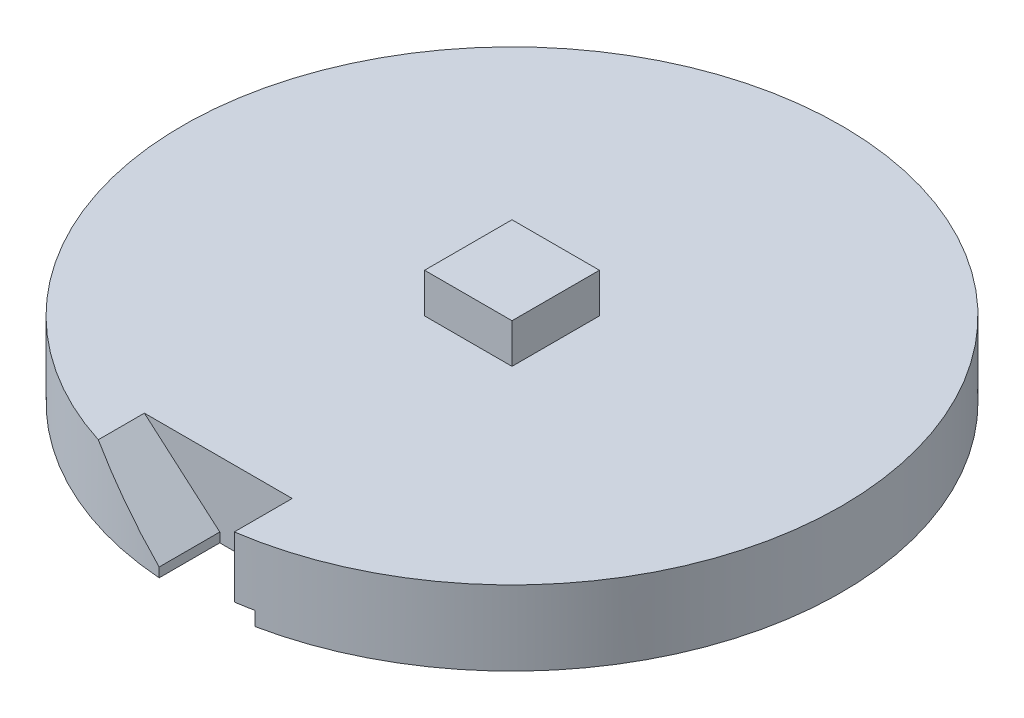
ISO-10303-21;
HEADER;
FILE_DESCRIPTION(('STEP AP214'),'2;1');
FILE_NAME('part.step','',(''),(''),'','','');
FILE_SCHEMA(('AUTOMOTIVE_DESIGN { 1 0 10303 214 1 1 1 1 }'));
ENDSEC;
DATA;
#1=APPLICATION_CONTEXT('core data for automotive mechanical design processes');
#2=APPLICATION_PROTOCOL_DEFINITION('international standard','automotive_design',2000,#1);
#3=PRODUCT_CONTEXT('',#1,'mechanical');
#4=PRODUCT('Part','Part','',(#3));
#5=PRODUCT_RELATED_PRODUCT_CATEGORY('part','',(#4));
#6=PRODUCT_DEFINITION_FORMATION('','',#4);
#7=PRODUCT_DEFINITION_CONTEXT('part definition',#1,'design');
#8=PRODUCT_DEFINITION('design','',#6,#7);
#9=PRODUCT_DEFINITION_SHAPE('','',#8);
#10=(LENGTH_UNIT() NAMED_UNIT(*) SI_UNIT(.MILLI.,.METRE.));
#11=(NAMED_UNIT(*) PLANE_ANGLE_UNIT() SI_UNIT($,.RADIAN.));
#12=(NAMED_UNIT(*) SI_UNIT($,.STERADIAN.) SOLID_ANGLE_UNIT());
#13=UNCERTAINTY_MEASURE_WITH_UNIT(LENGTH_MEASURE(1.E-05),#10,'distance_accuracy_value','');
#14=(GEOMETRIC_REPRESENTATION_CONTEXT(3) GLOBAL_UNCERTAINTY_ASSIGNED_CONTEXT((#13)) GLOBAL_UNIT_ASSIGNED_CONTEXT((#10,
#11,#12)) REPRESENTATION_CONTEXT('',''));
#15=CARTESIAN_POINT('',(0.,0.,0.));
#16=DIRECTION('',(0.,0.,1.));
#17=DIRECTION('',(1.,0.,0.));
#18=AXIS2_PLACEMENT_3D('',#15,#16,#17);
#19=CARTESIAN_POINT('',(0.,8.5,0.));
#20=DIRECTION('',(0.,1.,0.));
#21=DIRECTION('',(0.,0.,1.));
#22=AXIS2_PLACEMENT_3D('',#19,#20,#21);
#23=PLANE('',#22);
#24=DIRECTION('',(0.,0.,1.));
#25=VECTOR('',#24,1.);
#26=CARTESIAN_POINT('',(-11.3352998065365,8.5,30.5));
#27=LINE('',#26,#25);
#28=CARTESIAN_POINT('',(-11.3352998065365,8.5,30.5));
#29=VERTEX_POINT('',#28);
#30=CARTESIAN_POINT('',(-11.3352998065365,8.5,35.7457826644757));
#31=VERTEX_POINT('',#30);
#32=EDGE_CURVE('E315',#29,#31,#27,.T.);
#33=ORIENTED_EDGE('',*,*,#32,.F.);
#34=DIRECTION('',(-1.,0.,0.));
#35=VECTOR('',#34,1.);
#36=CARTESIAN_POINT('',(5.48783229101683,8.5,30.5));
#37=LINE('',#36,#35);
#38=CARTESIAN_POINT('',(5.48783229101683,8.5,30.5));
#39=VERTEX_POINT('',#38);
#40=EDGE_CURVE('E313',#39,#29,#37,.T.);
#41=ORIENTED_EDGE('',*,*,#40,.F.);
#42=DIRECTION('',(0.,0.,1.));
#43=VECTOR('',#42,1.);
#44=CARTESIAN_POINT('',(5.48783229101683,8.5,30.5));
#45=LINE('',#44,#43);
#46=CARTESIAN_POINT('',(5.48783229101683,8.5,37.0962760495669));
#47=VERTEX_POINT('',#46);
#48=EDGE_CURVE('E307',#39,#47,#45,.T.);
#49=ORIENTED_EDGE('',*,*,#48,.T.);
#50=CARTESIAN_POINT('',(0.,8.5,0.));
#51=DIRECTION('',(0.,1.,0.));
#52=DIRECTION('',(0.,0.,1.));
#53=AXIS2_PLACEMENT_3D('',#50,#51,#52);
#54=CIRCLE('',#53,37.5);
#55=EDGE_CURVE('E286',#47,#31,#54,.T.);
#56=ORIENTED_EDGE('',*,*,#55,.T.);
#57=EDGE_LOOP('',(#33,#41,#49,#56));
#58=FACE_BOUND('',#57,.T.);
#59=DIRECTION('',(1.,0.,0.));
#60=VECTOR('',#59,1.);
#61=CARTESIAN_POINT('',(0.,8.5,-4.975));
#62=LINE('',#61,#60);
#63=CARTESIAN_POINT('',(-4.975,8.5,-4.975));
#64=VERTEX_POINT('',#63);
#65=CARTESIAN_POINT('',(4.975,8.5,-4.975));
#66=VERTEX_POINT('',#65);
#67=EDGE_CURVE('E278',#64,#66,#62,.T.);
#68=ORIENTED_EDGE('',*,*,#67,.T.);
#69=DIRECTION('',(0.,0.,1.));
#70=VECTOR('',#69,1.);
#71=CARTESIAN_POINT('',(4.975,8.5,0.));
#72=LINE('',#71,#70);
#73=CARTESIAN_POINT('',(4.975,8.5,4.975));
#74=VERTEX_POINT('',#73);
#75=EDGE_CURVE('E282',#66,#74,#72,.T.);
#76=ORIENTED_EDGE('',*,*,#75,.T.);
#77=DIRECTION('',(-1.,0.,0.));
#78=VECTOR('',#77,1.);
#79=CARTESIAN_POINT('',(0.,8.5,4.975));
#80=LINE('',#79,#78);
#81=CARTESIAN_POINT('',(-4.975,8.5,4.975));
#82=VERTEX_POINT('',#81);
#83=EDGE_CURVE('E270',#74,#82,#80,.T.);
#84=ORIENTED_EDGE('',*,*,#83,.T.);
#85=DIRECTION('',(0.,0.,-1.));
#86=VECTOR('',#85,1.);
#87=CARTESIAN_POINT('',(-4.975,8.5,0.));
#88=LINE('',#87,#86);
#89=EDGE_CURVE('E274',#82,#64,#88,.T.);
#90=ORIENTED_EDGE('',*,*,#89,.T.);
#91=EDGE_LOOP('',(#68,#76,#84,#90));
#92=FACE_BOUND('',#91,.T.);
#93=ADVANCED_FACE('F45',(#58,#92),#23,.T.);
#94=CARTESIAN_POINT('',(0.,8.5,0.));
#95=DIRECTION('',(0.,-1.,0.));
#96=DIRECTION('',(0.,0.,-1.));
#97=AXIS2_PLACEMENT_3D('',#94,#95,#96);
#98=CYLINDRICAL_SURFACE('',#97,37.5);
#99=CARTESIAN_POINT('',(0.,0.,0.));
#100=DIRECTION('',(0.,1.,0.));
#101=DIRECTION('',(0.,0.,1.));
#102=AXIS2_PLACEMENT_3D('',#99,#100,#101);
#103=CIRCLE('',#102,37.5);
#104=CARTESIAN_POINT('',(7.49309439374879,0.,36.7437550667643));
#105=VERTEX_POINT('',#104);
#106=CARTESIAN_POINT('',(-2.75755208033518,0.,37.3984746550476));
#107=VERTEX_POINT('',#106);
#108=EDGE_CURVE('E179',#105,#107,#103,.T.);
#109=ORIENTED_EDGE('',*,*,#108,.T.);
#110=DIRECTION('',(0.,-1.,0.));
#111=VECTOR('',#110,1.);
#112=CARTESIAN_POINT('',(-2.75755208033518,8.5,37.3984746550476));
#113=LINE('',#112,#111);
#114=CARTESIAN_POINT('',(-2.75755208033518,1.07247206861908,37.3984746550476));
#115=VERTEX_POINT('',#114);
#116=EDGE_CURVE('E193',#107,#115,#113,.F.);
#117=ORIENTED_EDGE('',*,*,#116,.T.);
#118=CARTESIAN_POINT('',(0.,-1.315310336821,0.));
#119=DIRECTION('',(-0.654602325716553,-0.755973409033995,0.));
#120=DIRECTION('',(0.755973409033995,-0.654602325716553,0.));
#121=AXIS2_PLACEMENT_3D('',#118,#119,#120);
#122=ELLIPSE('',#121,49.6049193686833,37.5);
#123=EDGE_CURVE('E11',#115,#31,#122,.T.);
#124=ORIENTED_EDGE('',*,*,#123,.T.);
#125=ORIENTED_EDGE('',*,*,#55,.F.);
#126=DIRECTION('',(0.,-1.,0.));
#127=VECTOR('',#126,1.);
#128=CARTESIAN_POINT('',(5.48783229101683,8.5,37.0962760495669));
#129=LINE('',#128,#127);
#130=CARTESIAN_POINT('',(5.48783229101683,1.59559495075865,37.0962760495669));
#131=VERTEX_POINT('',#130);
#132=EDGE_CURVE('E54',#47,#131,#129,.T.);
#133=ORIENTED_EDGE('',*,*,#132,.T.);
#134=CARTESIAN_POINT('',(0.,1.59559495075865,0.));
#135=DIRECTION('',(0.,1.,0.));
#136=DIRECTION('',(0.,0.,1.));
#137=AXIS2_PLACEMENT_3D('',#134,#135,#136);
#138=CIRCLE('',#137,37.5);
#139=CARTESIAN_POINT('',(7.49309439374879,1.59559495075865,36.7437550667644));
#140=VERTEX_POINT('',#139);
#141=EDGE_CURVE('E163',#131,#140,#138,.T.);
#142=ORIENTED_EDGE('',*,*,#141,.T.);
#143=DIRECTION('',(0.,-1.,0.));
#144=VECTOR('',#143,1.);
#145=CARTESIAN_POINT('',(7.49309439374878,8.50000000000001,36.7437550667644));
#146=LINE('',#145,#144);
#147=EDGE_CURVE('E190',#140,#105,#146,.T.);
#148=ORIENTED_EDGE('',*,*,#147,.T.);
#149=EDGE_LOOP('',(#109,#117,#124,#125,#133,#142,#148));
#150=FACE_BOUND('',#149,.T.);
#151=ADVANCED_FACE('F47',(#150),#98,.T.);
#152=CARTESIAN_POINT('',(0.,0.,0.));
#153=DIRECTION('',(0.,1.,0.));
#154=DIRECTION('',(0.,0.,1.));
#155=AXIS2_PLACEMENT_3D('',#152,#153,#154);
#156=PLANE('',#155);
#157=CARTESIAN_POINT('',(0.,0.,0.));
#158=DIRECTION('',(0.,1.,0.));
#159=DIRECTION('',(0.,0.,1.));
#160=AXIS2_PLACEMENT_3D('',#157,#158,#159);
#161=CIRCLE('',#160,5.);
#162=CARTESIAN_POINT('',(0.,0.,5.));
#163=VERTEX_POINT('',#162);
#164=EDGE_CURVE('E164',#163,#163,#161,.F.);
#165=ORIENTED_EDGE('',*,*,#164,.F.);
#166=EDGE_LOOP('',(#165));
#167=FACE_BOUND('',#166,.T.);
#168=DIRECTION('',(-1.,0.,0.));
#169=VECTOR('',#168,1.);
#170=CARTESIAN_POINT('',(0.,0.,30.5));
#171=LINE('',#170,#169);
#172=CARTESIAN_POINT('',(7.49309439374879,0.,30.5));
#173=VERTEX_POINT('',#172);
#174=CARTESIAN_POINT('',(-2.75755208033518,0.,30.5));
#175=VERTEX_POINT('',#174);
#176=EDGE_CURVE('E154',#173,#175,#171,.T.);
#177=ORIENTED_EDGE('',*,*,#176,.T.);
#178=DIRECTION('',(0.,0.,1.));
#179=VECTOR('',#178,1.);
#180=CARTESIAN_POINT('',(-2.75755208033518,0.,30.5));
#181=LINE('',#180,#179);
#182=EDGE_CURVE('E194',#175,#107,#181,.T.);
#183=ORIENTED_EDGE('',*,*,#182,.T.);
#184=ORIENTED_EDGE('',*,*,#108,.F.);
#185=DIRECTION('',(0.,0.,1.));
#186=VECTOR('',#185,1.);
#187=CARTESIAN_POINT('',(7.49309439374879,0.,30.5));
#188=LINE('',#187,#186);
#189=EDGE_CURVE('E168',#173,#105,#188,.T.);
#190=ORIENTED_EDGE('',*,*,#189,.F.);
#191=EDGE_LOOP('',(#177,#183,#184,#190));
#192=FACE_BOUND('',#191,.T.);
#193=ADVANCED_FACE('F177',(#167,#192),#156,.F.);
#194=CARTESIAN_POINT('',(4.975,13.,-4.975));
#195=DIRECTION('',(-1.,0.,0.));
#196=DIRECTION('',(0.,0.,1.));
#197=AXIS2_PLACEMENT_3D('',#194,#195,#196);
#198=PLANE('',#197);
#199=ORIENTED_EDGE('',*,*,#75,.F.);
#200=DIRECTION('',(0.,-1.,0.));
#201=VECTOR('',#200,1.);
#202=CARTESIAN_POINT('',(4.975,13.,-4.975));
#203=LINE('',#202,#201);
#204=CARTESIAN_POINT('',(4.975,13.,-4.975));
#205=VERTEX_POINT('',#204);
#206=EDGE_CURVE('E266',#205,#66,#203,.T.);
#207=ORIENTED_EDGE('',*,*,#206,.F.);
#208=DIRECTION('',(0.,0.,-1.));
#209=VECTOR('',#208,1.);
#210=CARTESIAN_POINT('',(4.975,13.,-4.975));
#211=LINE('',#210,#209);
#212=CARTESIAN_POINT('',(4.975,13.,4.975));
#213=VERTEX_POINT('',#212);
#214=EDGE_CURVE('E242',#213,#205,#211,.T.);
#215=ORIENTED_EDGE('',*,*,#214,.F.);
#216=DIRECTION('',(0.,-1.,0.));
#217=VECTOR('',#216,1.);
#218=CARTESIAN_POINT('',(4.975,13.,4.975));
#219=LINE('',#218,#217);
#220=EDGE_CURVE('E255',#213,#74,#219,.T.);
#221=ORIENTED_EDGE('',*,*,#220,.T.);
#222=EDGE_LOOP('',(#199,#207,#215,#221));
#223=FACE_BOUND('',#222,.T.);
#224=ADVANCED_FACE('F356',(#223),#198,.F.);
#225=CARTESIAN_POINT('',(-4.975,13.,-4.975));
#226=DIRECTION('',(0.,0.,1.));
#227=DIRECTION('',(1.,0.,0.));
#228=AXIS2_PLACEMENT_3D('',#225,#226,#227);
#229=PLANE('',#228);
#230=ORIENTED_EDGE('',*,*,#67,.F.);
#231=DIRECTION('',(0.,-1.,0.));
#232=VECTOR('',#231,1.);
#233=CARTESIAN_POINT('',(-4.975,13.,-4.975));
#234=LINE('',#233,#232);
#235=CARTESIAN_POINT('',(-4.975,13.,-4.975));
#236=VERTEX_POINT('',#235);
#237=EDGE_CURVE('E262',#236,#64,#234,.T.);
#238=ORIENTED_EDGE('',*,*,#237,.F.);
#239=DIRECTION('',(-1.,0.,0.));
#240=VECTOR('',#239,1.);
#241=CARTESIAN_POINT('',(-4.975,13.,-4.975));
#242=LINE('',#241,#240);
#243=EDGE_CURVE('E246',#205,#236,#242,.T.);
#244=ORIENTED_EDGE('',*,*,#243,.F.);
#245=ORIENTED_EDGE('',*,*,#206,.T.);
#246=EDGE_LOOP('',(#230,#238,#244,#245));
#247=FACE_BOUND('',#246,.T.);
#248=ADVANCED_FACE('F364',(#247),#229,.F.);
#249=CARTESIAN_POINT('',(-4.975,13.,-4.975));
#250=DIRECTION('',(1.,0.,0.));
#251=DIRECTION('',(0.,0.,-1.));
#252=AXIS2_PLACEMENT_3D('',#249,#250,#251);
#253=PLANE('',#252);
#254=ORIENTED_EDGE('',*,*,#89,.F.);
#255=DIRECTION('',(0.,-1.,0.));
#256=VECTOR('',#255,1.);
#257=CARTESIAN_POINT('',(-4.975,13.,4.975));
#258=LINE('',#257,#256);
#259=CARTESIAN_POINT('',(-4.975,13.,4.975));
#260=VERTEX_POINT('',#259);
#261=EDGE_CURVE('E259',#260,#82,#258,.T.);
#262=ORIENTED_EDGE('',*,*,#261,.F.);
#263=DIRECTION('',(0.,0.,1.));
#264=VECTOR('',#263,1.);
#265=CARTESIAN_POINT('',(-4.975,13.,-4.975));
#266=LINE('',#265,#264);
#267=EDGE_CURVE('E249',#236,#260,#266,.T.);
#268=ORIENTED_EDGE('',*,*,#267,.F.);
#269=ORIENTED_EDGE('',*,*,#237,.T.);
#270=EDGE_LOOP('',(#254,#262,#268,#269));
#271=FACE_BOUND('',#270,.T.);
#272=ADVANCED_FACE('F389',(#271),#253,.F.);
#273=CARTESIAN_POINT('',(-4.975,13.,4.975));
#274=DIRECTION('',(0.,0.,-1.));
#275=DIRECTION('',(-1.,0.,0.));
#276=AXIS2_PLACEMENT_3D('',#273,#274,#275);
#277=PLANE('',#276);
#278=ORIENTED_EDGE('',*,*,#83,.F.);
#279=ORIENTED_EDGE('',*,*,#220,.F.);
#280=DIRECTION('',(1.,0.,0.));
#281=VECTOR('',#280,1.);
#282=CARTESIAN_POINT('',(-4.975,13.,4.975));
#283=LINE('',#282,#281);
#284=EDGE_CURVE('E252',#260,#213,#283,.T.);
#285=ORIENTED_EDGE('',*,*,#284,.F.);
#286=ORIENTED_EDGE('',*,*,#261,.T.);
#287=EDGE_LOOP('',(#278,#279,#285,#286));
#288=FACE_BOUND('',#287,.T.);
#289=ADVANCED_FACE('F381',(#288),#277,.F.);
#290=CARTESIAN_POINT('',(0.,13.,0.));
#291=DIRECTION('',(0.,1.,0.));
#292=DIRECTION('',(0.,0.,1.));
#293=AXIS2_PLACEMENT_3D('',#290,#291,#292);
#294=PLANE('',#293);
#295=ORIENTED_EDGE('',*,*,#214,.T.);
#296=ORIENTED_EDGE('',*,*,#243,.T.);
#297=ORIENTED_EDGE('',*,*,#267,.T.);
#298=ORIENTED_EDGE('',*,*,#284,.T.);
#299=EDGE_LOOP('',(#295,#296,#297,#298));
#300=FACE_BOUND('',#299,.T.);
#301=ADVANCED_FACE('F371',(#300),#294,.T.);
#302=CARTESIAN_POINT('',(0.,-10.,0.));
#303=DIRECTION('',(0.,1.,0.));
#304=DIRECTION('',(0.,0.,1.));
#305=AXIS2_PLACEMENT_3D('',#302,#303,#304);
#306=CYLINDRICAL_SURFACE('',#305,5.);
#307=CARTESIAN_POINT('',(0.,-10.,0.));
#308=DIRECTION('',(0.,-1.,0.));
#309=DIRECTION('',(0.,0.,-1.));
#310=AXIS2_PLACEMENT_3D('',#307,#308,#309);
#311=CIRCLE('',#310,5.);
#312=CARTESIAN_POINT('',(0.,-10.,-5.));
#313=VERTEX_POINT('',#312);
#314=EDGE_CURVE('E230',#313,#313,#311,.T.);
#315=ORIENTED_EDGE('',*,*,#314,.F.);
#316=EDGE_LOOP('',(#315));
#317=FACE_BOUND('',#316,.T.);
#318=ORIENTED_EDGE('',*,*,#164,.T.);
#319=EDGE_LOOP('',(#318));
#320=FACE_BOUND('',#319,.T.);
#321=ADVANCED_FACE('F368',(#317,#320),#306,.T.);
#322=CARTESIAN_POINT('',(0.,-10.,0.));
#323=DIRECTION('',(0.,-1.,0.));
#324=DIRECTION('',(0.,0.,-1.));
#325=AXIS2_PLACEMENT_3D('',#322,#323,#324);
#326=PLANE('',#325);
#327=DIRECTION('',(0.,0.,1.));
#328=VECTOR('',#327,1.);
#329=CARTESIAN_POINT('',(2.59784134756349,-10.,-1.32823797865468));
#330=LINE('',#329,#328);
#331=CARTESIAN_POINT('',(2.59784134756349,-10.,-1.32823797865468));
#332=VERTEX_POINT('',#331);
#333=CARTESIAN_POINT('',(2.59784134756349,-10.,1.67176202134533));
#334=VERTEX_POINT('',#333);
#335=EDGE_CURVE('E69',#332,#334,#330,.T.);
#336=ORIENTED_EDGE('',*,*,#335,.F.);
#337=DIRECTION('',(-1.,0.,0.));
#338=VECTOR('',#337,1.);
#339=CARTESIAN_POINT('',(2.59784134756349,-10.,-1.32823797865468));
#340=LINE('',#339,#338);
#341=CARTESIAN_POINT('',(-2.40215865243651,-10.,-1.32823797865468));
#342=VERTEX_POINT('',#341);
#343=EDGE_CURVE('E203',#332,#342,#340,.T.);
#344=ORIENTED_EDGE('',*,*,#343,.T.);
#345=DIRECTION('',(0.,0.,-1.));
#346=VECTOR('',#345,1.);
#347=CARTESIAN_POINT('',(-2.40215865243651,-10.,1.67176202134533));
#348=LINE('',#347,#346);
#349=CARTESIAN_POINT('',(-2.40215865243651,-10.,1.67176202134533));
#350=VERTEX_POINT('',#349);
#351=EDGE_CURVE('E220',#350,#342,#348,.T.);
#352=ORIENTED_EDGE('',*,*,#351,.F.);
#353=DIRECTION('',(1.,0.,0.));
#354=VECTOR('',#353,1.);
#355=CARTESIAN_POINT('',(-2.40215865243651,-10.,1.67176202134533));
#356=LINE('',#355,#354);
#357=EDGE_CURVE('E216',#350,#334,#356,.T.);
#358=ORIENTED_EDGE('',*,*,#357,.T.);
#359=EDGE_LOOP('',(#336,#344,#352,#358));
#360=FACE_BOUND('',#359,.T.);
#361=ORIENTED_EDGE('',*,*,#314,.T.);
#362=EDGE_LOOP('',(#361));
#363=FACE_BOUND('',#362,.T.);
#364=ADVANCED_FACE('F370',(#360,#363),#326,.T.);
#365=CARTESIAN_POINT('',(2.59784134756349,0.,-1.32823797865468));
#366=DIRECTION('',(1.,0.,0.));
#367=DIRECTION('',(0.,0.,-1.));
#368=AXIS2_PLACEMENT_3D('',#365,#366,#367);
#369=PLANE('',#368);
#370=ORIENTED_EDGE('',*,*,#335,.T.);
#371=DIRECTION('',(0.,-1.,0.));
#372=VECTOR('',#371,1.);
#373=CARTESIAN_POINT('',(2.59784134756349,0.,1.67176202134533));
#374=LINE('',#373,#372);
#375=CARTESIAN_POINT('',(2.59784134756349,0.,1.67176202134533));
#376=VERTEX_POINT('',#375);
#377=EDGE_CURVE('E213',#376,#334,#374,.T.);
#378=ORIENTED_EDGE('',*,*,#377,.F.);
#379=DIRECTION('',(0.,0.,1.));
#380=VECTOR('',#379,1.);
#381=CARTESIAN_POINT('',(2.59784134756349,0.,-1.32823797865468));
#382=LINE('',#381,#380);
#383=CARTESIAN_POINT('',(2.59784134756349,0.,-1.32823797865468));
#384=VERTEX_POINT('',#383);
#385=EDGE_CURVE('E198',#384,#376,#382,.T.);
#386=ORIENTED_EDGE('',*,*,#385,.F.);
#387=DIRECTION('',(0.,-1.,0.));
#388=VECTOR('',#387,1.);
#389=CARTESIAN_POINT('',(2.59784134756349,0.,-1.32823797865468));
#390=LINE('',#389,#388);
#391=EDGE_CURVE('E227',#384,#332,#390,.T.);
#392=ORIENTED_EDGE('',*,*,#391,.T.);
#393=EDGE_LOOP('',(#370,#378,#386,#392));
#394=FACE_BOUND('',#393,.T.);
#395=ADVANCED_FACE('F378',(#394),#369,.F.);
#396=CARTESIAN_POINT('',(2.59784134756349,0.,-1.32823797865468));
#397=DIRECTION('',(0.,0.,1.));
#398=DIRECTION('',(1.,0.,0.));
#399=AXIS2_PLACEMENT_3D('',#396,#397,#398);
#400=PLANE('',#399);
#401=ORIENTED_EDGE('',*,*,#343,.F.);
#402=ORIENTED_EDGE('',*,*,#391,.F.);
#403=DIRECTION('',(-1.,0.,0.));
#404=VECTOR('',#403,1.);
#405=CARTESIAN_POINT('',(2.59784134756349,0.,-1.32823797865468));
#406=LINE('',#405,#404);
#407=CARTESIAN_POINT('',(-2.40215865243651,0.,-1.32823797865468));
#408=VERTEX_POINT('',#407);
#409=EDGE_CURVE('E210',#384,#408,#406,.T.);
#410=ORIENTED_EDGE('',*,*,#409,.T.);
#411=DIRECTION('',(0.,-1.,0.));
#412=VECTOR('',#411,1.);
#413=CARTESIAN_POINT('',(-2.40215865243651,0.,-1.32823797865468));
#414=LINE('',#413,#412);
#415=EDGE_CURVE('E231',#408,#342,#414,.T.);
#416=ORIENTED_EDGE('',*,*,#415,.T.);
#417=EDGE_LOOP('',(#401,#402,#410,#416));
#418=FACE_BOUND('',#417,.T.);
#419=ADVANCED_FACE('F442',(#418),#400,.T.);
#420=CARTESIAN_POINT('',(-2.40215865243651,0.,1.67176202134533));
#421=DIRECTION('',(-1.,0.,0.));
#422=DIRECTION('',(0.,0.,1.));
#423=AXIS2_PLACEMENT_3D('',#420,#421,#422);
#424=PLANE('',#423);
#425=ORIENTED_EDGE('',*,*,#351,.T.);
#426=ORIENTED_EDGE('',*,*,#415,.F.);
#427=DIRECTION('',(0.,0.,-1.));
#428=VECTOR('',#427,1.);
#429=CARTESIAN_POINT('',(-2.40215865243651,0.,1.67176202134533));
#430=LINE('',#429,#428);
#431=CARTESIAN_POINT('',(-2.40215865243651,0.,1.67176202134533));
#432=VERTEX_POINT('',#431);
#433=EDGE_CURVE('E206',#432,#408,#430,.T.);
#434=ORIENTED_EDGE('',*,*,#433,.F.);
#435=DIRECTION('',(0.,-1.,0.));
#436=VECTOR('',#435,1.);
#437=CARTESIAN_POINT('',(-2.40215865243651,0.,1.67176202134533));
#438=LINE('',#437,#436);
#439=EDGE_CURVE('E234',#432,#350,#438,.T.);
#440=ORIENTED_EDGE('',*,*,#439,.T.);
#441=EDGE_LOOP('',(#425,#426,#434,#440));
#442=FACE_BOUND('',#441,.T.);
#443=ADVANCED_FACE('F450',(#442),#424,.F.);
#444=CARTESIAN_POINT('',(-2.40215865243651,0.,1.67176202134533));
#445=DIRECTION('',(0.,0.,-1.));
#446=DIRECTION('',(-1.,0.,0.));
#447=AXIS2_PLACEMENT_3D('',#444,#445,#446);
#448=PLANE('',#447);
#449=ORIENTED_EDGE('',*,*,#357,.F.);
#450=ORIENTED_EDGE('',*,*,#439,.F.);
#451=DIRECTION('',(1.,0.,0.));
#452=VECTOR('',#451,1.);
#453=CARTESIAN_POINT('',(-2.40215865243651,0.,1.67176202134533));
#454=LINE('',#453,#452);
#455=EDGE_CURVE('E202',#432,#376,#454,.T.);
#456=ORIENTED_EDGE('',*,*,#455,.T.);
#457=ORIENTED_EDGE('',*,*,#377,.T.);
#458=EDGE_LOOP('',(#449,#450,#456,#457));
#459=FACE_BOUND('',#458,.T.);
#460=ADVANCED_FACE('F460',(#459),#448,.T.);
#461=CARTESIAN_POINT('',(0.,0.,0.));
#462=DIRECTION('',(0.,1.,0.));
#463=DIRECTION('',(0.,0.,1.));
#464=AXIS2_PLACEMENT_3D('',#461,#462,#463);
#465=PLANE('',#464);
#466=ORIENTED_EDGE('',*,*,#385,.T.);
#467=ORIENTED_EDGE('',*,*,#455,.F.);
#468=ORIENTED_EDGE('',*,*,#433,.T.);
#469=ORIENTED_EDGE('',*,*,#409,.F.);
#470=EDGE_LOOP('',(#466,#467,#468,#469));
#471=FACE_BOUND('',#470,.T.);
#472=ADVANCED_FACE('F470',(#471),#465,.F.);
#473=CARTESIAN_POINT('',(-11.3352998065365,8.5,30.5));
#474=DIRECTION('',(-0.654602325716553,-0.755973409033995,0.));
#475=DIRECTION('',(0.755973409033995,-0.654602325716553,0.));
#476=AXIS2_PLACEMENT_3D('',#473,#474,#475);
#477=PLANE('',#476);
#478=DIRECTION('',(0.,0.,1.));
#479=VECTOR('',#478,1.);
#480=CARTESIAN_POINT('',(-2.75755208033518,1.07247206861908,30.5));
#481=LINE('',#480,#479);
#482=CARTESIAN_POINT('',(-2.75755208033518,1.07247206861908,30.5));
#483=VERTEX_POINT('',#482);
#484=EDGE_CURVE('E319',#483,#115,#481,.T.);
#485=ORIENTED_EDGE('',*,*,#484,.F.);
#486=DIRECTION('',(0.755973409033995,-0.654602325716553,0.));
#487=VECTOR('',#486,1.);
#488=CARTESIAN_POINT('',(-11.3352998065365,8.5,30.5));
#489=LINE('',#488,#487);
#490=EDGE_CURVE('E186',#29,#483,#489,.T.);
#491=ORIENTED_EDGE('',*,*,#490,.F.);
#492=ORIENTED_EDGE('',*,*,#32,.T.);
#493=ORIENTED_EDGE('',*,*,#123,.F.);
#494=EDGE_LOOP('',(#485,#491,#492,#493));
#495=FACE_BOUND('',#494,.T.);
#496=ADVANCED_FACE('F346',(#495),#477,.F.);
#497=CARTESIAN_POINT('',(5.48783229101683,5.96572027218461,30.5));
#498=DIRECTION('',(1.,0.,0.));
#499=DIRECTION('',(0.,0.,-1.));
#500=AXIS2_PLACEMENT_3D('',#497,#498,#499);
#501=PLANE('',#500);
#502=ORIENTED_EDGE('',*,*,#48,.F.);
#503=DIRECTION('',(0.,1.,0.));
#504=VECTOR('',#503,1.);
#505=CARTESIAN_POINT('',(5.48783229101683,5.96572027218461,30.5));
#506=LINE('',#505,#504);
#507=CARTESIAN_POINT('',(5.48783229101683,1.59559495075865,30.5));
#508=VERTEX_POINT('',#507);
#509=EDGE_CURVE('E331',#508,#39,#506,.T.);
#510=ORIENTED_EDGE('',*,*,#509,.F.);
#511=DIRECTION('',(0.,0.,1.));
#512=VECTOR('',#511,1.);
#513=CARTESIAN_POINT('',(5.48783229101683,1.59559495075865,30.5));
#514=LINE('',#513,#512);
#515=EDGE_CURVE('E184',#508,#131,#514,.T.);
#516=ORIENTED_EDGE('',*,*,#515,.T.);
#517=ORIENTED_EDGE('',*,*,#132,.F.);
#518=EDGE_LOOP('',(#502,#510,#516,#517));
#519=FACE_BOUND('',#518,.T.);
#520=ADVANCED_FACE('F305',(#519),#501,.F.);
#521=CARTESIAN_POINT('',(5.48783229101683,1.59559495075865,30.5));
#522=DIRECTION('',(0.,1.,0.));
#523=DIRECTION('',(0.,0.,1.));
#524=AXIS2_PLACEMENT_3D('',#521,#522,#523);
#525=PLANE('',#524);
#526=ORIENTED_EDGE('',*,*,#515,.F.);
#527=DIRECTION('',(-1.,0.,0.));
#528=VECTOR('',#527,1.);
#529=CARTESIAN_POINT('',(5.48783229101683,1.59559495075865,30.5));
#530=LINE('',#529,#528);
#531=CARTESIAN_POINT('',(7.49309439374879,1.59559495075865,30.5));
#532=VERTEX_POINT('',#531);
#533=EDGE_CURVE('E174',#532,#508,#530,.T.);
#534=ORIENTED_EDGE('',*,*,#533,.F.);
#535=DIRECTION('',(0.,0.,1.));
#536=VECTOR('',#535,1.);
#537=CARTESIAN_POINT('',(7.49309439374879,1.59559495075865,30.5));
#538=LINE('',#537,#536);
#539=EDGE_CURVE('E171',#532,#140,#538,.T.);
#540=ORIENTED_EDGE('',*,*,#539,.T.);
#541=ORIENTED_EDGE('',*,*,#141,.F.);
#542=EDGE_LOOP('',(#526,#534,#540,#541));
#543=FACE_BOUND('',#542,.T.);
#544=ADVANCED_FACE('F336',(#543),#525,.F.);
#545=CARTESIAN_POINT('',(-2.75755208033518,0.,30.5));
#546=DIRECTION('',(-1.,0.,0.));
#547=DIRECTION('',(0.,0.,1.));
#548=AXIS2_PLACEMENT_3D('',#545,#546,#547);
#549=PLANE('',#548);
#550=ORIENTED_EDGE('',*,*,#182,.F.);
#551=DIRECTION('',(0.,-1.,0.));
#552=VECTOR('',#551,1.);
#553=CARTESIAN_POINT('',(-2.75755208033518,0.,30.5));
#554=LINE('',#553,#552);
#555=EDGE_CURVE('E61',#483,#175,#554,.T.);
#556=ORIENTED_EDGE('',*,*,#555,.F.);
#557=ORIENTED_EDGE('',*,*,#484,.T.);
#558=ORIENTED_EDGE('',*,*,#116,.F.);
#559=EDGE_LOOP('',(#550,#556,#557,#558));
#560=FACE_BOUND('',#559,.T.);
#561=ADVANCED_FACE('F338',(#560),#549,.F.);
#562=CARTESIAN_POINT('',(7.49309439374879,1.59559495075865,30.5));
#563=DIRECTION('',(1.,0.,0.));
#564=DIRECTION('',(0.,1.,0.));
#565=AXIS2_PLACEMENT_3D('',#562,#563,#564);
#566=PLANE('',#565);
#567=ORIENTED_EDGE('',*,*,#539,.F.);
#568=DIRECTION('',(0.,1.,0.));
#569=VECTOR('',#568,1.);
#570=CARTESIAN_POINT('',(7.49309439374879,1.59559495075865,30.5));
#571=LINE('',#570,#569);
#572=EDGE_CURVE('E158',#173,#532,#571,.T.);
#573=ORIENTED_EDGE('',*,*,#572,.F.);
#574=ORIENTED_EDGE('',*,*,#189,.T.);
#575=ORIENTED_EDGE('',*,*,#147,.F.);
#576=EDGE_LOOP('',(#567,#573,#574,#575));
#577=FACE_BOUND('',#576,.T.);
#578=ADVANCED_FACE('F167',(#577),#566,.F.);
#579=CARTESIAN_POINT('',(0.,0.,30.5));
#580=DIRECTION('',(0.,0.,-1.));
#581=DIRECTION('',(-1.,0.,0.));
#582=AXIS2_PLACEMENT_3D('',#579,#580,#581);
#583=PLANE('',#582);
#584=ORIENTED_EDGE('',*,*,#572,.T.);
#585=ORIENTED_EDGE('',*,*,#533,.T.);
#586=ORIENTED_EDGE('',*,*,#509,.T.);
#587=ORIENTED_EDGE('',*,*,#40,.T.);
#588=ORIENTED_EDGE('',*,*,#490,.T.);
#589=ORIENTED_EDGE('',*,*,#555,.T.);
#590=ORIENTED_EDGE('',*,*,#176,.F.);
#591=EDGE_LOOP('',(#584,#585,#586,#587,#588,#589,#590));
#592=FACE_BOUND('',#591,.T.);
#593=ADVANCED_FACE('F156',(#592),#583,.F.);
#594=CLOSED_SHELL('',(#93,#151,#193,#224,#248,#272,#289,#301,#321,#364,#395,#419,#443,#460,#472,
#496,#520,#544,#561,#578,#593));
#595=MANIFOLD_SOLID_BREP('B2',#594);
#596=ADVANCED_BREP_SHAPE_REPRESENTATION('',(#18,#595),#14);
#597=SHAPE_DEFINITION_REPRESENTATION(#9,#596);
ENDSEC;
END-ISO-10303-21;
